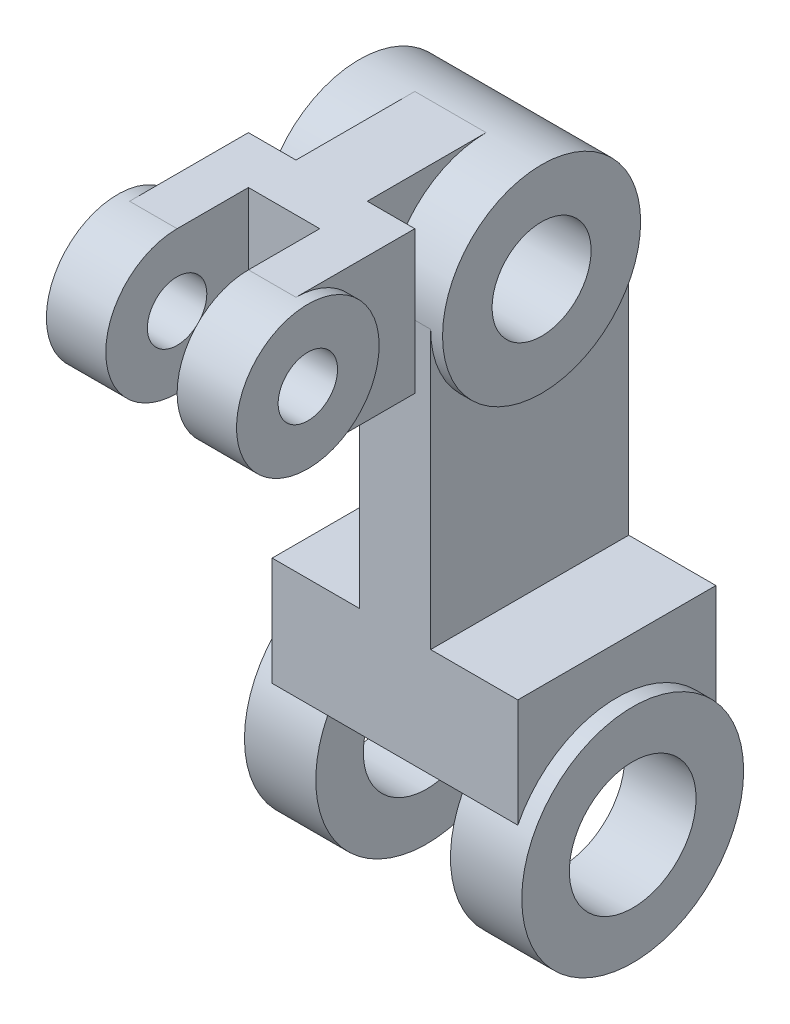
ISO-10303-21;
HEADER;
FILE_DESCRIPTION(('STEP AP214'),'2;1');
FILE_NAME('part.step','',(''),(''),'','','');
FILE_SCHEMA(('AUTOMOTIVE_DESIGN { 1 0 10303 214 1 1 1 1 }'));
ENDSEC;
DATA;
#1=APPLICATION_CONTEXT('core data for automotive mechanical design processes');
#2=APPLICATION_PROTOCOL_DEFINITION('international standard','automotive_design',2000,#1);
#3=PRODUCT_CONTEXT('',#1,'mechanical');
#4=PRODUCT('Part','Part','',(#3));
#5=PRODUCT_RELATED_PRODUCT_CATEGORY('part','',(#4));
#6=PRODUCT_DEFINITION_FORMATION('','',#4);
#7=PRODUCT_DEFINITION_CONTEXT('part definition',#1,'design');
#8=PRODUCT_DEFINITION('design','',#6,#7);
#9=PRODUCT_DEFINITION_SHAPE('','',#8);
#10=(LENGTH_UNIT() NAMED_UNIT(*) SI_UNIT(.MILLI.,.METRE.));
#11=(NAMED_UNIT(*) PLANE_ANGLE_UNIT() SI_UNIT($,.RADIAN.));
#12=(NAMED_UNIT(*) SI_UNIT($,.STERADIAN.) SOLID_ANGLE_UNIT());
#13=UNCERTAINTY_MEASURE_WITH_UNIT(LENGTH_MEASURE(1.E-05),#10,'distance_accuracy_value','');
#14=(GEOMETRIC_REPRESENTATION_CONTEXT(3) GLOBAL_UNCERTAINTY_ASSIGNED_CONTEXT((#13)) GLOBAL_UNIT_ASSIGNED_CONTEXT((#10,
#11,#12)) REPRESENTATION_CONTEXT('',''));
#15=CARTESIAN_POINT('',(0.,0.,0.));
#16=DIRECTION('',(0.,0.,1.));
#17=DIRECTION('',(1.,0.,0.));
#18=AXIS2_PLACEMENT_3D('',#15,#16,#17);
#19=CARTESIAN_POINT('',(13.,94.5660377358491,42.));
#20=DIRECTION('',(1.,0.,0.));
#21=DIRECTION('',(0.,0.,-1.));
#22=AXIS2_PLACEMENT_3D('',#19,#20,#21);
#23=PLANE('',#22);
#24=CARTESIAN_POINT('',(13.,112.566037735849,60.));
#25=DIRECTION('',(1.,0.,0.));
#26=DIRECTION('',(0.,0.,-1.));
#27=AXIS2_PLACEMENT_3D('',#24,#25,#26);
#28=CIRCLE('',#27,7.50000000000001);
#29=CARTESIAN_POINT('',(13.,112.566037735849,52.5));
#30=VERTEX_POINT('',#29);
#31=EDGE_CURVE('E215',#30,#30,#28,.T.);
#32=ORIENTED_EDGE('',*,*,#31,.F.);
#33=EDGE_LOOP('',(#32));
#34=FACE_BOUND('',#33,.T.);
#35=CARTESIAN_POINT('',(13.,112.566037735849,60.));
#36=DIRECTION('',(1.,0.,0.));
#37=DIRECTION('',(0.,0.,-1.));
#38=AXIS2_PLACEMENT_3D('',#35,#36,#37);
#39=CIRCLE('',#38,18.);
#40=CARTESIAN_POINT('',(13.,112.566037735849,42.));
#41=VERTEX_POINT('',#40);
#42=EDGE_CURVE('E235',#41,#41,#39,.F.);
#43=ORIENTED_EDGE('',*,*,#42,.F.);
#44=EDGE_LOOP('',(#43));
#45=FACE_BOUND('',#44,.T.);
#46=ADVANCED_FACE('F41',(#34,#45),#23,.T.);
#47=CARTESIAN_POINT('',(-35.,94.5660377358491,42.));
#48=DIRECTION('',(-1.,0.,0.));
#49=DIRECTION('',(0.,0.,1.));
#50=AXIS2_PLACEMENT_3D('',#47,#48,#49);
#51=PLANE('',#50);
#52=CARTESIAN_POINT('',(-35.,112.566037735849,60.));
#53=DIRECTION('',(-1.,0.,0.));
#54=DIRECTION('',(0.,0.,1.));
#55=AXIS2_PLACEMENT_3D('',#52,#53,#54);
#56=CIRCLE('',#55,7.50000000000001);
#57=CARTESIAN_POINT('',(-35.,112.566037735849,67.5));
#58=VERTEX_POINT('',#57);
#59=EDGE_CURVE('E513',#58,#58,#56,.T.);
#60=ORIENTED_EDGE('',*,*,#59,.F.);
#61=EDGE_LOOP('',(#60));
#62=FACE_BOUND('',#61,.T.);
#63=CARTESIAN_POINT('',(-35.,112.566037735849,60.));
#64=DIRECTION('',(1.,0.,0.));
#65=DIRECTION('',(0.,0.,1.));
#66=AXIS2_PLACEMENT_3D('',#63,#64,#65);
#67=CIRCLE('',#66,18.);
#68=CARTESIAN_POINT('',(-35.,112.566037735849,78.));
#69=VERTEX_POINT('',#68);
#70=EDGE_CURVE('E229',#69,#69,#67,.T.);
#71=ORIENTED_EDGE('',*,*,#70,.F.);
#72=EDGE_LOOP('',(#71));
#73=FACE_BOUND('',#72,.T.);
#74=ADVANCED_FACE('F539',(#62,#73),#51,.T.);
#75=CARTESIAN_POINT('',(0.,94.5660377358491,0.));
#76=DIRECTION('',(0.,-1.,0.));
#77=DIRECTION('',(0.,0.,-1.));
#78=AXIS2_PLACEMENT_3D('',#75,#76,#77);
#79=PLANE('',#78);
#80=DIRECTION('',(0.,0.,-1.));
#81=VECTOR('',#80,1.);
#82=CARTESIAN_POINT('',(9.99999999999999,94.5660377358491,30.));
#83=LINE('',#82,#81);
#84=CARTESIAN_POINT('',(10.,94.5660377358491,60.));
#85=VERTEX_POINT('',#84);
#86=CARTESIAN_POINT('',(9.99999999999999,94.5660377358491,30.));
#87=VERTEX_POINT('',#86);
#88=EDGE_CURVE('E196',#85,#87,#83,.T.);
#89=ORIENTED_EDGE('',*,*,#88,.F.);
#90=DIRECTION('',(-1.,0.,0.));
#91=VECTOR('',#90,1.);
#92=CARTESIAN_POINT('',(35.,94.5660377358491,60.));
#93=LINE('',#92,#91);
#94=CARTESIAN_POINT('',(-2.00000000000002,94.5660377358491,60.));
#95=VERTEX_POINT('',#94);
#96=EDGE_CURVE('E200',#85,#95,#93,.T.);
#97=ORIENTED_EDGE('',*,*,#96,.T.);
#98=DIRECTION('',(0.,0.,1.));
#99=VECTOR('',#98,1.);
#100=CARTESIAN_POINT('',(-2.00000000000002,94.5660377358491,78.));
#101=LINE('',#100,#99);
#102=CARTESIAN_POINT('',(-2.00000000000002,94.5660377358491,42.));
#103=VERTEX_POINT('',#102);
#104=EDGE_CURVE('E207',#103,#95,#101,.T.);
#105=ORIENTED_EDGE('',*,*,#104,.F.);
#106=DIRECTION('',(1.,0.,0.));
#107=VECTOR('',#106,1.);
#108=CARTESIAN_POINT('',(-20.,94.5660377358491,42.));
#109=LINE('',#108,#107);
#110=CARTESIAN_POINT('',(-20.,94.5660377358491,42.));
#111=VERTEX_POINT('',#110);
#112=EDGE_CURVE('E251',#111,#103,#109,.T.);
#113=ORIENTED_EDGE('',*,*,#112,.F.);
#114=DIRECTION('',(0.,0.,-1.));
#115=VECTOR('',#114,1.);
#116=CARTESIAN_POINT('',(-20.,94.5660377358491,78.));
#117=LINE('',#116,#115);
#118=CARTESIAN_POINT('',(-20.,94.5660377358491,60.));
#119=VERTEX_POINT('',#118);
#120=EDGE_CURVE('E248',#119,#111,#117,.T.);
#121=ORIENTED_EDGE('',*,*,#120,.F.);
#122=CARTESIAN_POINT('',(-32.,94.5660377358491,60.));
#123=VERTEX_POINT('',#122);
#124=EDGE_CURVE('E223',#119,#123,#93,.T.);
#125=ORIENTED_EDGE('',*,*,#124,.T.);
#126=DIRECTION('',(0.,0.,1.));
#127=VECTOR('',#126,1.);
#128=CARTESIAN_POINT('',(-32.,94.5660377358491,30.));
#129=LINE('',#128,#127);
#130=CARTESIAN_POINT('',(-32.,94.5660377358491,30.));
#131=VERTEX_POINT('',#130);
#132=EDGE_CURVE('E244',#131,#123,#129,.T.);
#133=ORIENTED_EDGE('',*,*,#132,.F.);
#134=DIRECTION('',(-1.,0.,0.));
#135=VECTOR('',#134,1.);
#136=CARTESIAN_POINT('',(-32.,94.5660377358491,30.));
#137=LINE('',#136,#135);
#138=CARTESIAN_POINT('',(-20.,94.5660377358491,30.));
#139=VERTEX_POINT('',#138);
#140=EDGE_CURVE('E240',#139,#131,#137,.T.);
#141=ORIENTED_EDGE('',*,*,#140,.F.);
#142=DIRECTION('',(0.,0.,1.));
#143=VECTOR('',#142,1.);
#144=CARTESIAN_POINT('',(-20.,94.5660377358491,0.));
#145=LINE('',#144,#143);
#146=CARTESIAN_POINT('',(-20.,94.5660377358491,22.4499443206436));
#147=VERTEX_POINT('',#146);
#148=EDGE_CURVE('E263',#147,#139,#145,.T.);
#149=ORIENTED_EDGE('',*,*,#148,.F.);
#150=DIRECTION('',(1.,0.,0.));
#151=VECTOR('',#150,1.);
#152=CARTESIAN_POINT('',(-34.,94.5660377358491,22.4499443206436));
#153=LINE('',#152,#151);
#154=CARTESIAN_POINT('',(-8.99999999999999,94.5660377358491,22.4499443206436));
#155=VERTEX_POINT('',#154);
#156=EDGE_CURVE('E302',#155,#147,#153,.F.);
#157=ORIENTED_EDGE('',*,*,#156,.F.);
#158=DIRECTION('',(0.,0.,-1.));
#159=VECTOR('',#158,1.);
#160=CARTESIAN_POINT('',(-9.,94.5660377358491,25.));
#161=LINE('',#160,#159);
#162=CARTESIAN_POINT('',(-9.,94.5660377358491,25.));
#163=VERTEX_POINT('',#162);
#164=EDGE_CURVE('E321',#163,#155,#161,.T.);
#165=ORIENTED_EDGE('',*,*,#164,.F.);
#166=DIRECTION('',(-1.,0.,0.));
#167=VECTOR('',#166,1.);
#168=CARTESIAN_POINT('',(0.,94.5660377358491,25.));
#169=LINE('',#168,#167);
#170=CARTESIAN_POINT('',(-2.00000000000001,94.5660377358491,25.));
#171=VERTEX_POINT('',#170);
#172=EDGE_CURVE('E325',#171,#163,#169,.T.);
#173=ORIENTED_EDGE('',*,*,#172,.F.);
#174=DIRECTION('',(0.,0.,-1.));
#175=VECTOR('',#174,1.);
#176=CARTESIAN_POINT('',(-1.99999999999999,94.5660377358491,0.));
#177=LINE('',#176,#175);
#178=CARTESIAN_POINT('',(-2.00000000000001,94.5660377358491,30.));
#179=VERTEX_POINT('',#178);
#180=EDGE_CURVE('E259',#179,#171,#177,.T.);
#181=ORIENTED_EDGE('',*,*,#180,.F.);
#182=DIRECTION('',(-1.,0.,0.));
#183=VECTOR('',#182,1.);
#184=CARTESIAN_POINT('',(9.99999999999999,94.5660377358491,30.));
#185=LINE('',#184,#183);
#186=EDGE_CURVE('E204',#87,#179,#185,.T.);
#187=ORIENTED_EDGE('',*,*,#186,.F.);
#188=EDGE_LOOP('',(#89,#97,#105,#113,#121,#125,#133,#141,#149,#157,#165,#173,#181,#187));
#189=FACE_BOUND('',#188,.T.);
#190=ADVANCED_FACE('F197',(#189),#79,.T.);
#191=CARTESIAN_POINT('',(0.,130.566037735849,0.));
#192=DIRECTION('',(0.,-1.,0.));
#193=DIRECTION('',(0.,0.,-1.));
#194=AXIS2_PLACEMENT_3D('',#191,#192,#193);
#195=PLANE('',#194);
#196=DIRECTION('',(1.,0.,0.));
#197=VECTOR('',#196,1.);
#198=CARTESIAN_POINT('',(0.,130.566037735849,60.));
#199=LINE('',#198,#197);
#200=CARTESIAN_POINT('',(-2.00000000000002,130.566037735849,60.));
#201=VERTEX_POINT('',#200);
#202=CARTESIAN_POINT('',(10.,130.566037735849,60.));
#203=VERTEX_POINT('',#202);
#204=EDGE_CURVE('E51',#201,#203,#199,.T.);
#205=ORIENTED_EDGE('',*,*,#204,.T.);
#206=DIRECTION('',(0.,0.,-1.));
#207=VECTOR('',#206,1.);
#208=CARTESIAN_POINT('',(9.99999999999999,130.566037735849,30.));
#209=LINE('',#208,#207);
#210=CARTESIAN_POINT('',(9.99999999999999,130.566037735849,30.));
#211=VERTEX_POINT('',#210);
#212=EDGE_CURVE('E58',#203,#211,#209,.T.);
#213=ORIENTED_EDGE('',*,*,#212,.T.);
#214=DIRECTION('',(-1.,0.,0.));
#215=VECTOR('',#214,1.);
#216=CARTESIAN_POINT('',(9.99999999999999,130.566037735849,30.));
#217=LINE('',#216,#215);
#218=CARTESIAN_POINT('',(-2.00000000000001,130.566037735849,30.));
#219=VERTEX_POINT('',#218);
#220=EDGE_CURVE('E286',#211,#219,#217,.T.);
#221=ORIENTED_EDGE('',*,*,#220,.T.);
#222=DIRECTION('',(0.,0.,-1.));
#223=VECTOR('',#222,1.);
#224=CARTESIAN_POINT('',(-1.99999999999999,130.566037735849,0.));
#225=LINE('',#224,#223);
#226=CARTESIAN_POINT('',(-2.,130.566037735849,0.));
#227=VERTEX_POINT('',#226);
#228=EDGE_CURVE('E290',#219,#227,#225,.T.);
#229=ORIENTED_EDGE('',*,*,#228,.T.);
#230=DIRECTION('',(-1.,0.,0.));
#231=VECTOR('',#230,1.);
#232=CARTESIAN_POINT('',(-20.,130.566037735849,0.));
#233=LINE('',#232,#231);
#234=CARTESIAN_POINT('',(-20.,130.566037735849,0.));
#235=VERTEX_POINT('',#234);
#236=EDGE_CURVE('E293',#227,#235,#233,.T.);
#237=ORIENTED_EDGE('',*,*,#236,.T.);
#238=DIRECTION('',(0.,0.,1.));
#239=VECTOR('',#238,1.);
#240=CARTESIAN_POINT('',(-20.,130.566037735849,0.));
#241=LINE('',#240,#239);
#242=CARTESIAN_POINT('',(-20.,130.566037735849,30.));
#243=VERTEX_POINT('',#242);
#244=EDGE_CURVE('E245',#235,#243,#241,.T.);
#245=ORIENTED_EDGE('',*,*,#244,.T.);
#246=DIRECTION('',(-1.,0.,0.));
#247=VECTOR('',#246,1.);
#248=CARTESIAN_POINT('',(-32.,130.566037735849,30.));
#249=LINE('',#248,#247);
#250=CARTESIAN_POINT('',(-32.,130.566037735849,30.));
#251=VERTEX_POINT('',#250);
#252=EDGE_CURVE('E239',#243,#251,#249,.T.);
#253=ORIENTED_EDGE('',*,*,#252,.T.);
#254=DIRECTION('',(0.,0.,1.));
#255=VECTOR('',#254,1.);
#256=CARTESIAN_POINT('',(-32.,130.566037735849,30.));
#257=LINE('',#256,#255);
#258=CARTESIAN_POINT('',(-32.,130.566037735849,60.));
#259=VERTEX_POINT('',#258);
#260=EDGE_CURVE('E270',#251,#259,#257,.T.);
#261=ORIENTED_EDGE('',*,*,#260,.T.);
#262=CARTESIAN_POINT('',(-20.,130.566037735849,60.));
#263=VERTEX_POINT('',#262);
#264=EDGE_CURVE('E11',#259,#263,#199,.T.);
#265=ORIENTED_EDGE('',*,*,#264,.T.);
#266=DIRECTION('',(0.,0.,-1.));
#267=VECTOR('',#266,1.);
#268=CARTESIAN_POINT('',(-20.,130.566037735849,78.));
#269=LINE('',#268,#267);
#270=CARTESIAN_POINT('',(-20.,130.566037735849,42.));
#271=VERTEX_POINT('',#270);
#272=EDGE_CURVE('E273',#263,#271,#269,.T.);
#273=ORIENTED_EDGE('',*,*,#272,.T.);
#274=DIRECTION('',(1.,0.,0.));
#275=VECTOR('',#274,1.);
#276=CARTESIAN_POINT('',(-20.,130.566037735849,42.));
#277=LINE('',#276,#275);
#278=CARTESIAN_POINT('',(-2.00000000000002,130.566037735849,42.));
#279=VERTEX_POINT('',#278);
#280=EDGE_CURVE('E276',#271,#279,#277,.T.);
#281=ORIENTED_EDGE('',*,*,#280,.T.);
#282=DIRECTION('',(0.,0.,1.));
#283=VECTOR('',#282,1.);
#284=CARTESIAN_POINT('',(-2.00000000000002,130.566037735849,78.));
#285=LINE('',#284,#283);
#286=EDGE_CURVE('E280',#279,#201,#285,.T.);
#287=ORIENTED_EDGE('',*,*,#286,.T.);
#288=EDGE_LOOP('',(#205,#213,#221,#229,#237,#245,#253,#261,#265,#273,#281,#287));
#289=FACE_BOUND('',#288,.T.);
#290=ADVANCED_FACE('F479',(#289),#195,.F.);
#291=CARTESIAN_POINT('',(-2.00000000000002,94.5660377358491,78.));
#292=DIRECTION('',(-1.,0.,0.));
#293=DIRECTION('',(0.,0.,1.));
#294=AXIS2_PLACEMENT_3D('',#291,#292,#293);
#295=PLANE('',#294);
#296=CARTESIAN_POINT('',(-2.00000000000002,112.566037735849,60.));
#297=DIRECTION('',(-1.,0.,0.));
#298=DIRECTION('',(0.,0.,1.));
#299=AXIS2_PLACEMENT_3D('',#296,#297,#298);
#300=CIRCLE('',#299,7.50000000000001);
#301=CARTESIAN_POINT('',(-2.00000000000002,112.566037735849,67.5));
#302=VERTEX_POINT('',#301);
#303=EDGE_CURVE('E509',#302,#302,#300,.T.);
#304=ORIENTED_EDGE('',*,*,#303,.F.);
#305=EDGE_LOOP('',(#304));
#306=FACE_BOUND('',#305,.T.);
#307=ORIENTED_EDGE('',*,*,#104,.T.);
#308=CARTESIAN_POINT('',(-2.00000000000002,112.566037735849,60.));
#309=DIRECTION('',(-1.,0.,0.));
#310=DIRECTION('',(0.,0.,1.));
#311=AXIS2_PLACEMENT_3D('',#308,#309,#310);
#312=CIRCLE('',#311,18.);
#313=EDGE_CURVE('E219',#201,#95,#312,.F.);
#314=ORIENTED_EDGE('',*,*,#313,.F.);
#315=ORIENTED_EDGE('',*,*,#286,.F.);
#316=DIRECTION('',(0.,1.,0.));
#317=VECTOR('',#316,1.);
#318=CARTESIAN_POINT('',(-2.00000000000002,94.5660377358491,42.));
#319=LINE('',#318,#317);
#320=EDGE_CURVE('E309',#103,#279,#319,.T.);
#321=ORIENTED_EDGE('',*,*,#320,.F.);
#322=EDGE_LOOP('',(#307,#314,#315,#321));
#323=FACE_BOUND('',#322,.T.);
#324=ADVANCED_FACE('F482',(#306,#323),#295,.T.);
#325=CARTESIAN_POINT('',(-20.,94.5660377358491,78.));
#326=DIRECTION('',(1.,0.,0.));
#327=DIRECTION('',(0.,0.,-1.));
#328=AXIS2_PLACEMENT_3D('',#325,#326,#327);
#329=PLANE('',#328);
#330=CARTESIAN_POINT('',(-20.,112.566037735849,60.));
#331=DIRECTION('',(1.,0.,0.));
#332=DIRECTION('',(0.,0.,-1.));
#333=AXIS2_PLACEMENT_3D('',#330,#331,#332);
#334=CIRCLE('',#333,7.50000000000001);
#335=CARTESIAN_POINT('',(-20.,112.566037735849,52.5));
#336=VERTEX_POINT('',#335);
#337=EDGE_CURVE('E45',#336,#336,#334,.T.);
#338=ORIENTED_EDGE('',*,*,#337,.F.);
#339=EDGE_LOOP('',(#338));
#340=FACE_BOUND('',#339,.T.);
#341=CARTESIAN_POINT('',(-20.,112.566037735849,60.));
#342=DIRECTION('',(1.,0.,0.));
#343=DIRECTION('',(0.,0.,-1.));
#344=AXIS2_PLACEMENT_3D('',#341,#342,#343);
#345=CIRCLE('',#344,18.);
#346=EDGE_CURVE('E222',#119,#263,#345,.F.);
#347=ORIENTED_EDGE('',*,*,#346,.F.);
#348=ORIENTED_EDGE('',*,*,#120,.T.);
#349=DIRECTION('',(0.,1.,0.));
#350=VECTOR('',#349,1.);
#351=CARTESIAN_POINT('',(-20.,94.5660377358491,42.));
#352=LINE('',#351,#350);
#353=EDGE_CURVE('E312',#111,#271,#352,.T.);
#354=ORIENTED_EDGE('',*,*,#353,.T.);
#355=ORIENTED_EDGE('',*,*,#272,.F.);
#356=EDGE_LOOP('',(#347,#348,#354,#355));
#357=FACE_BOUND('',#356,.T.);
#358=ADVANCED_FACE('F492',(#340,#357),#329,.T.);
#359=CARTESIAN_POINT('',(-34.,-4.43396226415092,0.));
#360=DIRECTION('',(1.,0.,0.));
#361=DIRECTION('',(0.,0.,-1.));
#362=AXIS2_PLACEMENT_3D('',#359,#360,#361);
#363=CYLINDRICAL_SURFACE('',#362,28.);
#364=DIRECTION('',(1.,0.,0.));
#365=VECTOR('',#364,1.);
#366=CARTESIAN_POINT('',(-34.,8.17555794876757,25.));
#367=LINE('',#366,#365);
#368=CARTESIAN_POINT('',(-17.,8.17555794876757,25.));
#369=VERTEX_POINT('',#368);
#370=CARTESIAN_POINT('',(17.,8.17555794876757,25.));
#371=VERTEX_POINT('',#370);
#372=EDGE_CURVE('E411',#369,#371,#367,.T.);
#373=ORIENTED_EDGE('',*,*,#372,.F.);
#374=CARTESIAN_POINT('',(-17.,-4.43396226415092,0.));
#375=DIRECTION('',(1.,0.,0.));
#376=DIRECTION('',(0.,0.,-1.));
#377=AXIS2_PLACEMENT_3D('',#374,#375,#376);
#378=CIRCLE('',#377,28.);
#379=CARTESIAN_POINT('',(-17.,8.17555794876757,-25.));
#380=VERTEX_POINT('',#379);
#381=EDGE_CURVE('E346',#380,#369,#378,.T.);
#382=ORIENTED_EDGE('',*,*,#381,.F.);
#383=DIRECTION('',(1.,0.,0.));
#384=VECTOR('',#383,1.);
#385=CARTESIAN_POINT('',(-34.,8.17555794876757,-25.));
#386=LINE('',#385,#384);
#387=CARTESIAN_POINT('',(17.,8.17555794876757,-25.));
#388=VERTEX_POINT('',#387);
#389=EDGE_CURVE('E475',#380,#388,#386,.T.);
#390=ORIENTED_EDGE('',*,*,#389,.T.);
#391=CARTESIAN_POINT('',(17.,-4.43396226415092,0.));
#392=DIRECTION('',(1.,0.,0.));
#393=DIRECTION('',(0.,0.,-1.));
#394=AXIS2_PLACEMENT_3D('',#391,#392,#393);
#395=CIRCLE('',#394,28.);
#396=EDGE_CURVE('E371',#388,#371,#395,.T.);
#397=ORIENTED_EDGE('',*,*,#396,.T.);
#398=EDGE_LOOP('',(#373,#382,#390,#397));
#399=FACE_BOUND('',#398,.T.);
#400=ADVANCED_FACE('F525',(#399),#363,.F.);
#401=CARTESIAN_POINT('',(-34.,130.566037735849,25.));
#402=DIRECTION('',(1.,0.,0.));
#403=DIRECTION('',(0.,1.,0.));
#404=AXIS2_PLACEMENT_3D('',#401,#402,#403);
#405=PLANE('',#404);
#406=CARTESIAN_POINT('',(-34.,105.566037735849,0.));
#407=DIRECTION('',(-1.,0.,0.));
#408=DIRECTION('',(0.,-1.,0.));
#409=AXIS2_PLACEMENT_3D('',#406,#407,#408);
#410=CIRCLE('',#409,12.5);
#411=CARTESIAN_POINT('',(-34.,93.0660377358491,0.));
#412=VERTEX_POINT('',#411);
#413=EDGE_CURVE('E375',#412,#412,#410,.T.);
#414=ORIENTED_EDGE('',*,*,#413,.F.);
#415=EDGE_LOOP('',(#414));
#416=FACE_BOUND('',#415,.T.);
#417=CARTESIAN_POINT('',(-34.,105.566037735849,0.));
#418=DIRECTION('',(-1.,0.,0.));
#419=DIRECTION('',(0.,0.,-1.));
#420=AXIS2_PLACEMENT_3D('',#417,#418,#419);
#421=CIRCLE('',#420,25.);
#422=CARTESIAN_POINT('',(-34.,105.566037735849,-25.));
#423=VERTEX_POINT('',#422);
#424=EDGE_CURVE('E388',#423,#423,#421,.T.);
#425=ORIENTED_EDGE('',*,*,#424,.T.);
#426=EDGE_LOOP('',(#425));
#427=FACE_BOUND('',#426,.T.);
#428=ADVANCED_FACE('F531',(#416,#427),#405,.F.);
#429=CARTESIAN_POINT('',(12.,80.5660377358491,25.));
#430=DIRECTION('',(-1.,0.,0.));
#431=DIRECTION('',(0.,0.,1.));
#432=AXIS2_PLACEMENT_3D('',#429,#430,#431);
#433=PLANE('',#432);
#434=CARTESIAN_POINT('',(12.,105.566037735849,0.));
#435=DIRECTION('',(-1.,0.,0.));
#436=DIRECTION('',(0.,0.,1.));
#437=AXIS2_PLACEMENT_3D('',#434,#435,#436);
#438=CIRCLE('',#437,12.5);
#439=CARTESIAN_POINT('',(12.,105.566037735849,12.5));
#440=VERTEX_POINT('',#439);
#441=EDGE_CURVE('E379',#440,#440,#438,.T.);
#442=ORIENTED_EDGE('',*,*,#441,.T.);
#443=EDGE_LOOP('',(#442));
#444=FACE_BOUND('',#443,.T.);
#445=CARTESIAN_POINT('',(12.,105.566037735849,0.));
#446=DIRECTION('',(-1.,0.,0.));
#447=DIRECTION('',(0.,0.,1.));
#448=AXIS2_PLACEMENT_3D('',#445,#446,#447);
#449=CIRCLE('',#448,25.);
#450=CARTESIAN_POINT('',(12.,105.566037735849,25.));
#451=VERTEX_POINT('',#450);
#452=EDGE_CURVE('E410',#451,#451,#449,.F.);
#453=ORIENTED_EDGE('',*,*,#452,.T.);
#454=EDGE_LOOP('',(#453));
#455=FACE_BOUND('',#454,.T.);
#456=ADVANCED_FACE('F695',(#444,#455),#433,.F.);
#457=CARTESIAN_POINT('',(0.,0.,25.));
#458=DIRECTION('',(0.,0.,-1.));
#459=DIRECTION('',(-1.,0.,0.));
#460=AXIS2_PLACEMENT_3D('',#457,#458,#459);
#461=PLANE('',#460);
#462=DIRECTION('',(1.,0.,0.));
#463=VECTOR('',#462,1.);
#464=CARTESIAN_POINT('',(-34.,105.566037735849,25.));
#465=LINE('',#464,#463);
#466=CARTESIAN_POINT('',(-2.00000000000001,105.566037735849,25.));
#467=VERTEX_POINT('',#466);
#468=CARTESIAN_POINT('',(9.,105.566037735849,25.));
#469=VERTEX_POINT('',#468);
#470=EDGE_CURVE('E393',#467,#469,#465,.T.);
#471=ORIENTED_EDGE('',*,*,#470,.F.);
#472=DIRECTION('',(0.,-1.,0.));
#473=VECTOR('',#472,1.);
#474=CARTESIAN_POINT('',(-2.00000000000001,0.,25.));
#475=LINE('',#474,#473);
#476=EDGE_CURVE('E333',#467,#171,#475,.T.);
#477=ORIENTED_EDGE('',*,*,#476,.T.);
#478=ORIENTED_EDGE('',*,*,#172,.T.);
#479=DIRECTION('',(0.,-1.,0.));
#480=VECTOR('',#479,1.);
#481=CARTESIAN_POINT('',(-9.,35.5660377358491,25.));
#482=LINE('',#481,#480);
#483=CARTESIAN_POINT('',(-9.,35.5660377358491,25.));
#484=VERTEX_POINT('',#483);
#485=EDGE_CURVE('E427',#163,#484,#482,.T.);
#486=ORIENTED_EDGE('',*,*,#485,.T.);
#487=DIRECTION('',(-1.,0.,0.));
#488=VECTOR('',#487,1.);
#489=CARTESIAN_POINT('',(-31.,35.5660377358491,25.));
#490=LINE('',#489,#488);
#491=CARTESIAN_POINT('',(-31.,35.5660377358491,25.));
#492=VERTEX_POINT('',#491);
#493=EDGE_CURVE('E430',#484,#492,#490,.T.);
#494=ORIENTED_EDGE('',*,*,#493,.T.);
#495=DIRECTION('',(0.,-1.,0.));
#496=VECTOR('',#495,1.);
#497=CARTESIAN_POINT('',(-31.,-32.4339622641509,25.));
#498=LINE('',#497,#496);
#499=CARTESIAN_POINT('',(-31.,8.17555794876757,25.));
#500=VERTEX_POINT('',#499);
#501=EDGE_CURVE('E433',#492,#500,#498,.T.);
#502=ORIENTED_EDGE('',*,*,#501,.T.);
#503=EDGE_CURVE('E406',#500,#369,#367,.T.);
#504=ORIENTED_EDGE('',*,*,#503,.T.);
#505=ORIENTED_EDGE('',*,*,#372,.T.);
#506=CARTESIAN_POINT('',(31.,8.17555794876757,25.));
#507=VERTEX_POINT('',#506);
#508=EDGE_CURVE('E405',#371,#507,#367,.T.);
#509=ORIENTED_EDGE('',*,*,#508,.T.);
#510=DIRECTION('',(0.,1.,0.));
#511=VECTOR('',#510,1.);
#512=CARTESIAN_POINT('',(31.,-32.4339622641509,25.));
#513=LINE('',#512,#511);
#514=CARTESIAN_POINT('',(31.,35.5660377358491,25.));
#515=VERTEX_POINT('',#514);
#516=EDGE_CURVE('E416',#507,#515,#513,.T.);
#517=ORIENTED_EDGE('',*,*,#516,.T.);
#518=DIRECTION('',(-1.,0.,0.));
#519=VECTOR('',#518,1.);
#520=CARTESIAN_POINT('',(31.,35.5660377358491,25.));
#521=LINE('',#520,#519);
#522=CARTESIAN_POINT('',(9.,35.5660377358491,25.));
#523=VERTEX_POINT('',#522);
#524=EDGE_CURVE('E419',#515,#523,#521,.T.);
#525=ORIENTED_EDGE('',*,*,#524,.T.);
#526=DIRECTION('',(0.,1.,0.));
#527=VECTOR('',#526,1.);
#528=CARTESIAN_POINT('',(9.,35.5660377358491,25.));
#529=LINE('',#528,#527);
#530=EDGE_CURVE('E423',#523,#469,#529,.T.);
#531=ORIENTED_EDGE('',*,*,#530,.T.);
#532=EDGE_LOOP('',(#471,#477,#478,#486,#494,#502,#504,#505,#509,#517,#525,#531));
#533=FACE_BOUND('',#532,.T.);
#534=ADVANCED_FACE('F689',(#533),#461,.F.);
#535=CARTESIAN_POINT('',(0.,0.,-25.));
#536=DIRECTION('',(0.,0.,-1.));
#537=DIRECTION('',(-1.,0.,0.));
#538=AXIS2_PLACEMENT_3D('',#535,#536,#537);
#539=PLANE('',#538);
#540=DIRECTION('',(0.,-1.,0.));
#541=VECTOR('',#540,1.);
#542=CARTESIAN_POINT('',(-9.,35.5660377358491,-25.));
#543=LINE('',#542,#541);
#544=CARTESIAN_POINT('',(-9.,105.566037735849,-25.));
#545=VERTEX_POINT('',#544);
#546=CARTESIAN_POINT('',(-9.,35.5660377358491,-25.));
#547=VERTEX_POINT('',#546);
#548=EDGE_CURVE('E447',#545,#547,#543,.T.);
#549=ORIENTED_EDGE('',*,*,#548,.F.);
#550=DIRECTION('',(1.,0.,0.));
#551=VECTOR('',#550,1.);
#552=CARTESIAN_POINT('',(-34.,105.566037735849,-25.));
#553=LINE('',#552,#551);
#554=CARTESIAN_POINT('',(9.,105.566037735849,-25.));
#555=VERTEX_POINT('',#554);
#556=EDGE_CURVE('E392',#545,#555,#553,.T.);
#557=ORIENTED_EDGE('',*,*,#556,.T.);
#558=DIRECTION('',(0.,1.,0.));
#559=VECTOR('',#558,1.);
#560=CARTESIAN_POINT('',(9.,35.5660377358491,-25.));
#561=LINE('',#560,#559);
#562=CARTESIAN_POINT('',(9.,35.5660377358491,-25.));
#563=VERTEX_POINT('',#562);
#564=EDGE_CURVE('E443',#563,#555,#561,.T.);
#565=ORIENTED_EDGE('',*,*,#564,.F.);
#566=DIRECTION('',(-1.,0.,0.));
#567=VECTOR('',#566,1.);
#568=CARTESIAN_POINT('',(31.,35.5660377358491,-25.));
#569=LINE('',#568,#567);
#570=CARTESIAN_POINT('',(31.,35.5660377358491,-25.));
#571=VERTEX_POINT('',#570);
#572=EDGE_CURVE('E440',#571,#563,#569,.T.);
#573=ORIENTED_EDGE('',*,*,#572,.F.);
#574=DIRECTION('',(0.,1.,0.));
#575=VECTOR('',#574,1.);
#576=CARTESIAN_POINT('',(31.,-32.4339622641509,-25.));
#577=LINE('',#576,#575);
#578=CARTESIAN_POINT('',(31.,8.17555794876757,-25.));
#579=VERTEX_POINT('',#578);
#580=EDGE_CURVE('E415',#579,#571,#577,.T.);
#581=ORIENTED_EDGE('',*,*,#580,.F.);
#582=EDGE_CURVE('E471',#388,#579,#386,.T.);
#583=ORIENTED_EDGE('',*,*,#582,.F.);
#584=ORIENTED_EDGE('',*,*,#389,.F.);
#585=CARTESIAN_POINT('',(-31.,8.17555794876757,-25.));
#586=VERTEX_POINT('',#585);
#587=EDGE_CURVE('E472',#586,#380,#386,.T.);
#588=ORIENTED_EDGE('',*,*,#587,.F.);
#589=DIRECTION('',(0.,-1.,0.));
#590=VECTOR('',#589,1.);
#591=CARTESIAN_POINT('',(-31.,-32.4339622641509,-25.));
#592=LINE('',#591,#590);
#593=CARTESIAN_POINT('',(-31.,35.5660377358491,-25.));
#594=VERTEX_POINT('',#593);
#595=EDGE_CURVE('E420',#594,#586,#592,.T.);
#596=ORIENTED_EDGE('',*,*,#595,.F.);
#597=DIRECTION('',(-1.,0.,0.));
#598=VECTOR('',#597,1.);
#599=CARTESIAN_POINT('',(-31.,35.5660377358491,-25.));
#600=LINE('',#599,#598);
#601=EDGE_CURVE('E450',#547,#594,#600,.T.);
#602=ORIENTED_EDGE('',*,*,#601,.F.);
#603=EDGE_LOOP('',(#549,#557,#565,#573,#581,#583,#584,#588,#596,#602));
#604=FACE_BOUND('',#603,.T.);
#605=ADVANCED_FACE('F694',(#604),#539,.T.);
#606=CARTESIAN_POINT('',(31.,-32.4339622641509,25.));
#607=DIRECTION('',(-1.,0.,0.));
#608=DIRECTION('',(0.,-1.,0.));
#609=AXIS2_PLACEMENT_3D('',#606,#607,#608);
#610=PLANE('',#609);
#611=ORIENTED_EDGE('',*,*,#516,.F.);
#612=CARTESIAN_POINT('',(31.,-4.43396226415092,0.));
#613=DIRECTION('',(1.,0.,0.));
#614=DIRECTION('',(0.,0.,-1.));
#615=AXIS2_PLACEMENT_3D('',#612,#613,#614);
#616=CIRCLE('',#615,28.);
#617=EDGE_CURVE('E387',#579,#507,#616,.T.);
#618=ORIENTED_EDGE('',*,*,#617,.F.);
#619=ORIENTED_EDGE('',*,*,#580,.T.);
#620=DIRECTION('',(0.,0.,-1.));
#621=VECTOR('',#620,1.);
#622=CARTESIAN_POINT('',(31.,35.5660377358491,25.));
#623=LINE('',#622,#621);
#624=EDGE_CURVE('E467',#515,#571,#623,.T.);
#625=ORIENTED_EDGE('',*,*,#624,.F.);
#626=EDGE_LOOP('',(#611,#618,#619,#625));
#627=FACE_BOUND('',#626,.T.);
#628=ADVANCED_FACE('F43',(#627),#610,.F.);
#629=CARTESIAN_POINT('',(31.,35.5660377358491,25.));
#630=DIRECTION('',(0.,-1.,0.));
#631=DIRECTION('',(1.,0.,0.));
#632=AXIS2_PLACEMENT_3D('',#629,#630,#631);
#633=PLANE('',#632);
#634=ORIENTED_EDGE('',*,*,#572,.T.);
#635=DIRECTION('',(0.,0.,-1.));
#636=VECTOR('',#635,1.);
#637=CARTESIAN_POINT('',(9.,35.5660377358491,25.));
#638=LINE('',#637,#636);
#639=EDGE_CURVE('E463',#523,#563,#638,.T.);
#640=ORIENTED_EDGE('',*,*,#639,.F.);
#641=ORIENTED_EDGE('',*,*,#524,.F.);
#642=ORIENTED_EDGE('',*,*,#624,.T.);
#643=EDGE_LOOP('',(#634,#640,#641,#642));
#644=FACE_BOUND('',#643,.T.);
#645=ADVANCED_FACE('F816',(#644),#633,.F.);
#646=CARTESIAN_POINT('',(9.,35.5660377358491,25.));
#647=DIRECTION('',(-1.,0.,0.));
#648=DIRECTION('',(0.,-1.,0.));
#649=AXIS2_PLACEMENT_3D('',#646,#647,#648);
#650=PLANE('',#649);
#651=ORIENTED_EDGE('',*,*,#564,.T.);
#652=CARTESIAN_POINT('',(9.,105.566037735849,0.));
#653=DIRECTION('',(1.,0.,0.));
#654=DIRECTION('',(0.,0.,-1.));
#655=AXIS2_PLACEMENT_3D('',#652,#653,#654);
#656=CIRCLE('',#655,25.);
#657=EDGE_CURVE('E383',#469,#555,#656,.T.);
#658=ORIENTED_EDGE('',*,*,#657,.F.);
#659=ORIENTED_EDGE('',*,*,#530,.F.);
#660=ORIENTED_EDGE('',*,*,#639,.T.);
#661=EDGE_LOOP('',(#651,#658,#659,#660));
#662=FACE_BOUND('',#661,.T.);
#663=ADVANCED_FACE('F679',(#662),#650,.F.);
#664=CARTESIAN_POINT('',(-9.,35.5660377358491,25.));
#665=DIRECTION('',(1.,0.,0.));
#666=DIRECTION('',(0.,1.,0.));
#667=AXIS2_PLACEMENT_3D('',#664,#665,#666);
#668=PLANE('',#667);
#669=ORIENTED_EDGE('',*,*,#485,.F.);
#670=ORIENTED_EDGE('',*,*,#164,.T.);
#671=CARTESIAN_POINT('',(-9.,105.566037735849,0.));
#672=DIRECTION('',(1.,0.,0.));
#673=DIRECTION('',(0.,1.,0.));
#674=AXIS2_PLACEMENT_3D('',#671,#672,#673);
#675=CIRCLE('',#674,25.);
#676=EDGE_CURVE('E380',#155,#545,#675,.T.);
#677=ORIENTED_EDGE('',*,*,#676,.T.);
#678=ORIENTED_EDGE('',*,*,#548,.T.);
#679=DIRECTION('',(0.,0.,-1.));
#680=VECTOR('',#679,1.);
#681=CARTESIAN_POINT('',(-9.,35.5660377358491,25.));
#682=LINE('',#681,#680);
#683=EDGE_CURVE('E459',#484,#547,#682,.T.);
#684=ORIENTED_EDGE('',*,*,#683,.F.);
#685=EDGE_LOOP('',(#669,#670,#677,#678,#684));
#686=FACE_BOUND('',#685,.T.);
#687=ADVANCED_FACE('F673',(#686),#668,.F.);
#688=CARTESIAN_POINT('',(-31.,35.5660377358491,25.));
#689=DIRECTION('',(0.,-1.,0.));
#690=DIRECTION('',(1.,0.,0.));
#691=AXIS2_PLACEMENT_3D('',#688,#689,#690);
#692=PLANE('',#691);
#693=ORIENTED_EDGE('',*,*,#601,.T.);
#694=DIRECTION('',(0.,0.,-1.));
#695=VECTOR('',#694,1.);
#696=CARTESIAN_POINT('',(-31.,35.5660377358491,25.));
#697=LINE('',#696,#695);
#698=EDGE_CURVE('E437',#492,#594,#697,.T.);
#699=ORIENTED_EDGE('',*,*,#698,.F.);
#700=ORIENTED_EDGE('',*,*,#493,.F.);
#701=ORIENTED_EDGE('',*,*,#683,.T.);
#702=EDGE_LOOP('',(#693,#699,#700,#701));
#703=FACE_BOUND('',#702,.T.);
#704=ADVANCED_FACE('F678',(#703),#692,.F.);
#705=CARTESIAN_POINT('',(-31.,-32.4339622641509,25.));
#706=DIRECTION('',(1.,0.,0.));
#707=DIRECTION('',(0.,1.,0.));
#708=AXIS2_PLACEMENT_3D('',#705,#706,#707);
#709=PLANE('',#708);
#710=ORIENTED_EDGE('',*,*,#595,.T.);
#711=CARTESIAN_POINT('',(-31.,-4.43396226415092,0.));
#712=DIRECTION('',(1.,0.,0.));
#713=DIRECTION('',(0.,1.,0.));
#714=AXIS2_PLACEMENT_3D('',#711,#712,#713);
#715=CIRCLE('',#714,28.);
#716=EDGE_CURVE('E396',#586,#500,#715,.T.);
#717=ORIENTED_EDGE('',*,*,#716,.T.);
#718=ORIENTED_EDGE('',*,*,#501,.F.);
#719=ORIENTED_EDGE('',*,*,#698,.T.);
#720=EDGE_LOOP('',(#710,#717,#718,#719));
#721=FACE_BOUND('',#720,.T.);
#722=ADVANCED_FACE('F665',(#721),#709,.F.);
#723=CARTESIAN_POINT('',(-34.,105.566037735849,0.));
#724=DIRECTION('',(1.,0.,0.));
#725=DIRECTION('',(0.,0.,-1.));
#726=AXIS2_PLACEMENT_3D('',#723,#724,#725);
#727=CYLINDRICAL_SURFACE('',#726,25.);
#728=ORIENTED_EDGE('',*,*,#156,.T.);
#729=CARTESIAN_POINT('',(-20.,105.566037735849,0.));
#730=DIRECTION('',(-1.,0.,0.));
#731=DIRECTION('',(0.,0.,1.));
#732=AXIS2_PLACEMENT_3D('',#729,#730,#731);
#733=CIRCLE('',#732,25.);
#734=EDGE_CURVE('E337',#147,#235,#733,.T.);
#735=ORIENTED_EDGE('',*,*,#734,.T.);
#736=ORIENTED_EDGE('',*,*,#236,.F.);
#737=CARTESIAN_POINT('',(-1.99999999999999,105.566037735849,0.));
#738=DIRECTION('',(1.,0.,0.));
#739=DIRECTION('',(0.,0.,-1.));
#740=AXIS2_PLACEMENT_3D('',#737,#738,#739);
#741=CIRCLE('',#740,25.);
#742=EDGE_CURVE('E329',#227,#467,#741,.T.);
#743=ORIENTED_EDGE('',*,*,#742,.T.);
#744=ORIENTED_EDGE('',*,*,#470,.T.);
#745=ORIENTED_EDGE('',*,*,#657,.T.);
#746=ORIENTED_EDGE('',*,*,#556,.F.);
#747=ORIENTED_EDGE('',*,*,#676,.F.);
#748=EDGE_LOOP('',(#728,#735,#736,#743,#744,#745,#746,#747));
#749=FACE_BOUND('',#748,.T.);
#750=ORIENTED_EDGE('',*,*,#452,.F.);
#751=EDGE_LOOP('',(#750));
#752=FACE_BOUND('',#751,.T.);
#753=ORIENTED_EDGE('',*,*,#424,.F.);
#754=EDGE_LOOP('',(#753));
#755=FACE_BOUND('',#754,.T.);
#756=ADVANCED_FACE('F619',(#749,#752,#755),#727,.T.);
#757=CARTESIAN_POINT('',(31.,105.566037735849,0.));
#758=DIRECTION('',(-1.,0.,0.));
#759=DIRECTION('',(0.,-1.,0.));
#760=AXIS2_PLACEMENT_3D('',#757,#758,#759);
#761=CYLINDRICAL_SURFACE('',#760,12.5);
#762=ORIENTED_EDGE('',*,*,#413,.T.);
#763=EDGE_LOOP('',(#762));
#764=FACE_BOUND('',#763,.T.);
#765=ORIENTED_EDGE('',*,*,#441,.F.);
#766=EDGE_LOOP('',(#765));
#767=FACE_BOUND('',#766,.T.);
#768=ADVANCED_FACE('F612',(#764,#767),#761,.F.);
#769=CARTESIAN_POINT('',(17.,-4.43396226415092,0.));
#770=DIRECTION('',(1.,0.,0.));
#771=DIRECTION('',(0.,0.,-1.));
#772=AXIS2_PLACEMENT_3D('',#769,#770,#771);
#773=CYLINDRICAL_SURFACE('',#772,28.);
#774=CARTESIAN_POINT('',(35.,-4.43396226415092,0.));
#775=DIRECTION('',(1.,0.,0.));
#776=DIRECTION('',(0.,0.,-1.));
#777=AXIS2_PLACEMENT_3D('',#774,#775,#776);
#778=CIRCLE('',#777,28.);
#779=CARTESIAN_POINT('',(35.,-4.43396226415092,-28.));
#780=VERTEX_POINT('',#779);
#781=EDGE_CURVE('E362',#780,#780,#778,.T.);
#782=ORIENTED_EDGE('',*,*,#781,.F.);
#783=EDGE_LOOP('',(#782));
#784=FACE_BOUND('',#783,.T.);
#785=ORIENTED_EDGE('',*,*,#508,.F.);
#786=EDGE_CURVE('E370',#371,#388,#395,.T.);
#787=ORIENTED_EDGE('',*,*,#786,.T.);
#788=ORIENTED_EDGE('',*,*,#582,.T.);
#789=ORIENTED_EDGE('',*,*,#617,.T.);
#790=EDGE_LOOP('',(#785,#787,#788,#789));
#791=FACE_BOUND('',#790,.T.);
#792=ADVANCED_FACE('F618',(#784,#791),#773,.T.);
#793=CARTESIAN_POINT('',(17.,-4.43396226415092,0.));
#794=DIRECTION('',(1.,0.,0.));
#795=DIRECTION('',(0.,0.,-1.));
#796=AXIS2_PLACEMENT_3D('',#793,#794,#795);
#797=PLANE('',#796);
#798=CARTESIAN_POINT('',(17.,-4.43396226415092,0.));
#799=DIRECTION('',(1.,0.,0.));
#800=DIRECTION('',(0.,0.,-1.));
#801=AXIS2_PLACEMENT_3D('',#798,#799,#800);
#802=CIRCLE('',#801,16.);
#803=CARTESIAN_POINT('',(17.,-4.43396226415092,-16.));
#804=VERTEX_POINT('',#803);
#805=EDGE_CURVE('E366',#804,#804,#802,.T.);
#806=ORIENTED_EDGE('',*,*,#805,.T.);
#807=EDGE_LOOP('',(#806));
#808=FACE_BOUND('',#807,.T.);
#809=ORIENTED_EDGE('',*,*,#396,.F.);
#810=ORIENTED_EDGE('',*,*,#786,.F.);
#811=EDGE_LOOP('',(#809,#810));
#812=FACE_BOUND('',#811,.T.);
#813=ADVANCED_FACE('F788',(#808,#812),#797,.F.);
#814=CARTESIAN_POINT('',(17.,-4.43396226415092,0.));
#815=DIRECTION('',(1.,0.,0.));
#816=DIRECTION('',(0.,0.,-1.));
#817=AXIS2_PLACEMENT_3D('',#814,#815,#816);
#818=CYLINDRICAL_SURFACE('',#817,16.);
#819=ORIENTED_EDGE('',*,*,#805,.F.);
#820=EDGE_LOOP('',(#819));
#821=FACE_BOUND('',#820,.T.);
#822=CARTESIAN_POINT('',(35.,-4.43396226415092,0.));
#823=DIRECTION('',(1.,0.,0.));
#824=DIRECTION('',(0.,0.,-1.));
#825=AXIS2_PLACEMENT_3D('',#822,#823,#824);
#826=CIRCLE('',#825,16.);
#827=CARTESIAN_POINT('',(35.,-4.43396226415092,-16.));
#828=VERTEX_POINT('',#827);
#829=EDGE_CURVE('E358',#828,#828,#826,.T.);
#830=ORIENTED_EDGE('',*,*,#829,.T.);
#831=EDGE_LOOP('',(#830));
#832=FACE_BOUND('',#831,.T.);
#833=ADVANCED_FACE('F778',(#821,#832),#818,.F.);
#834=CARTESIAN_POINT('',(35.,-4.43396226415092,0.));
#835=DIRECTION('',(1.,0.,0.));
#836=DIRECTION('',(0.,0.,-1.));
#837=AXIS2_PLACEMENT_3D('',#834,#835,#836);
#838=PLANE('',#837);
#839=ORIENTED_EDGE('',*,*,#781,.T.);
#840=EDGE_LOOP('',(#839));
#841=FACE_BOUND('',#840,.T.);
#842=ORIENTED_EDGE('',*,*,#829,.F.);
#843=EDGE_LOOP('',(#842));
#844=FACE_BOUND('',#843,.T.);
#845=ADVANCED_FACE('F742',(#841,#844),#838,.T.);
#846=CARTESIAN_POINT('',(-35.,-4.43396226415092,0.));
#847=DIRECTION('',(1.,0.,0.));
#848=DIRECTION('',(0.,0.,-1.));
#849=AXIS2_PLACEMENT_3D('',#846,#847,#848);
#850=CYLINDRICAL_SURFACE('',#849,28.);
#851=CARTESIAN_POINT('',(-35.,-4.43396226415092,0.));
#852=DIRECTION('',(1.,0.,0.));
#853=DIRECTION('',(0.,0.,-1.));
#854=AXIS2_PLACEMENT_3D('',#851,#852,#853);
#855=CIRCLE('',#854,28.);
#856=CARTESIAN_POINT('',(-35.,-4.43396226415092,-28.));
#857=VERTEX_POINT('',#856);
#858=EDGE_CURVE('E354',#857,#857,#855,.T.);
#859=ORIENTED_EDGE('',*,*,#858,.T.);
#860=EDGE_LOOP('',(#859));
#861=FACE_BOUND('',#860,.T.);
#862=ORIENTED_EDGE('',*,*,#503,.F.);
#863=ORIENTED_EDGE('',*,*,#716,.F.);
#864=ORIENTED_EDGE('',*,*,#587,.T.);
#865=EDGE_CURVE('E345',#369,#380,#378,.T.);
#866=ORIENTED_EDGE('',*,*,#865,.F.);
#867=EDGE_LOOP('',(#862,#863,#864,#866));
#868=FACE_BOUND('',#867,.T.);
#869=ADVANCED_FACE('F730',(#861,#868),#850,.T.);
#870=CARTESIAN_POINT('',(-35.,-4.43396226415092,0.));
#871=DIRECTION('',(1.,0.,0.));
#872=DIRECTION('',(0.,0.,-1.));
#873=AXIS2_PLACEMENT_3D('',#870,#871,#872);
#874=PLANE('',#873);
#875=CARTESIAN_POINT('',(-35.,-4.43396226415092,0.));
#876=DIRECTION('',(1.,0.,0.));
#877=DIRECTION('',(0.,0.,-1.));
#878=AXIS2_PLACEMENT_3D('',#875,#876,#877);
#879=CIRCLE('',#878,16.);
#880=CARTESIAN_POINT('',(-35.,-4.43396226415092,-16.));
#881=VERTEX_POINT('',#880);
#882=EDGE_CURVE('E350',#881,#881,#879,.T.);
#883=ORIENTED_EDGE('',*,*,#882,.T.);
#884=EDGE_LOOP('',(#883));
#885=FACE_BOUND('',#884,.T.);
#886=ORIENTED_EDGE('',*,*,#858,.F.);
#887=EDGE_LOOP('',(#886));
#888=FACE_BOUND('',#887,.T.);
#889=ADVANCED_FACE('F719',(#885,#888),#874,.F.);
#890=CARTESIAN_POINT('',(-35.,-4.43396226415092,0.));
#891=DIRECTION('',(1.,0.,0.));
#892=DIRECTION('',(0.,0.,-1.));
#893=AXIS2_PLACEMENT_3D('',#890,#891,#892);
#894=CYLINDRICAL_SURFACE('',#893,16.);
#895=ORIENTED_EDGE('',*,*,#882,.F.);
#896=EDGE_LOOP('',(#895));
#897=FACE_BOUND('',#896,.T.);
#898=CARTESIAN_POINT('',(-17.,-4.43396226415092,0.));
#899=DIRECTION('',(1.,0.,0.));
#900=DIRECTION('',(0.,0.,-1.));
#901=AXIS2_PLACEMENT_3D('',#898,#899,#900);
#902=CIRCLE('',#901,16.);
#903=CARTESIAN_POINT('',(-17.,-4.43396226415092,-16.));
#904=VERTEX_POINT('',#903);
#905=EDGE_CURVE('E341',#904,#904,#902,.T.);
#906=ORIENTED_EDGE('',*,*,#905,.T.);
#907=EDGE_LOOP('',(#906));
#908=FACE_BOUND('',#907,.T.);
#909=ADVANCED_FACE('F708',(#897,#908),#894,.F.);
#910=CARTESIAN_POINT('',(-17.,-4.43396226415092,0.));
#911=DIRECTION('',(1.,0.,0.));
#912=DIRECTION('',(0.,0.,-1.));
#913=AXIS2_PLACEMENT_3D('',#910,#911,#912);
#914=PLANE('',#913);
#915=ORIENTED_EDGE('',*,*,#381,.T.);
#916=ORIENTED_EDGE('',*,*,#865,.T.);
#917=EDGE_LOOP('',(#915,#916));
#918=FACE_BOUND('',#917,.T.);
#919=ORIENTED_EDGE('',*,*,#905,.F.);
#920=EDGE_LOOP('',(#919));
#921=FACE_BOUND('',#920,.T.);
#922=ADVANCED_FACE('F577',(#918,#921),#914,.T.);
#923=CARTESIAN_POINT('',(-20.,94.5660377358491,0.));
#924=DIRECTION('',(-1.,0.,0.));
#925=DIRECTION('',(0.,0.,1.));
#926=AXIS2_PLACEMENT_3D('',#923,#924,#925);
#927=PLANE('',#926);
#928=ORIENTED_EDGE('',*,*,#734,.F.);
#929=ORIENTED_EDGE('',*,*,#148,.T.);
#930=DIRECTION('',(0.,1.,0.));
#931=VECTOR('',#930,1.);
#932=CARTESIAN_POINT('',(-20.,94.5660377358491,30.));
#933=LINE('',#932,#931);
#934=EDGE_CURVE('E299',#139,#243,#933,.T.);
#935=ORIENTED_EDGE('',*,*,#934,.T.);
#936=ORIENTED_EDGE('',*,*,#244,.F.);
#937=EDGE_LOOP('',(#928,#929,#935,#936));
#938=FACE_BOUND('',#937,.T.);
#939=ADVANCED_FACE('F573',(#938),#927,.T.);
#940=CARTESIAN_POINT('',(-1.99999999999999,94.5660377358491,0.));
#941=DIRECTION('',(1.,0.,0.));
#942=DIRECTION('',(0.,0.,-1.));
#943=AXIS2_PLACEMENT_3D('',#940,#941,#942);
#944=PLANE('',#943);
#945=ORIENTED_EDGE('',*,*,#476,.F.);
#946=ORIENTED_EDGE('',*,*,#742,.F.);
#947=ORIENTED_EDGE('',*,*,#228,.F.);
#948=DIRECTION('',(0.,1.,0.));
#949=VECTOR('',#948,1.);
#950=CARTESIAN_POINT('',(-2.00000000000001,94.5660377358491,30.));
#951=LINE('',#950,#949);
#952=EDGE_CURVE('E303',#179,#219,#951,.T.);
#953=ORIENTED_EDGE('',*,*,#952,.F.);
#954=ORIENTED_EDGE('',*,*,#180,.T.);
#955=EDGE_LOOP('',(#945,#946,#947,#953,#954));
#956=FACE_BOUND('',#955,.T.);
#957=ADVANCED_FACE('F566',(#956),#944,.T.);
#958=CARTESIAN_POINT('',(-32.,94.5660377358491,30.));
#959=DIRECTION('',(0.,0.,-1.));
#960=DIRECTION('',(-1.,0.,0.));
#961=AXIS2_PLACEMENT_3D('',#958,#959,#960);
#962=PLANE('',#961);
#963=ORIENTED_EDGE('',*,*,#252,.F.);
#964=ORIENTED_EDGE('',*,*,#934,.F.);
#965=ORIENTED_EDGE('',*,*,#140,.T.);
#966=DIRECTION('',(0.,1.,0.));
#967=VECTOR('',#966,1.);
#968=CARTESIAN_POINT('',(-32.,94.5660377358491,30.));
#969=LINE('',#968,#967);
#970=EDGE_CURVE('E266',#131,#251,#969,.T.);
#971=ORIENTED_EDGE('',*,*,#970,.T.);
#972=EDGE_LOOP('',(#963,#964,#965,#971));
#973=FACE_BOUND('',#972,.T.);
#974=ADVANCED_FACE('F561',(#973),#962,.T.);
#975=CARTESIAN_POINT('',(9.99999999999999,94.5660377358491,30.));
#976=DIRECTION('',(0.,0.,-1.));
#977=DIRECTION('',(-1.,0.,0.));
#978=AXIS2_PLACEMENT_3D('',#975,#976,#977);
#979=PLANE('',#978);
#980=ORIENTED_EDGE('',*,*,#220,.F.);
#981=DIRECTION('',(0.,1.,0.));
#982=VECTOR('',#981,1.);
#983=CARTESIAN_POINT('',(9.99999999999999,94.5660377358491,30.));
#984=LINE('',#983,#982);
#985=EDGE_CURVE('E306',#87,#211,#984,.T.);
#986=ORIENTED_EDGE('',*,*,#985,.F.);
#987=ORIENTED_EDGE('',*,*,#186,.T.);
#988=ORIENTED_EDGE('',*,*,#952,.T.);
#989=EDGE_LOOP('',(#980,#986,#987,#988));
#990=FACE_BOUND('',#989,.T.);
#991=ADVANCED_FACE('F557',(#990),#979,.T.);
#992=CARTESIAN_POINT('',(9.99999999999999,94.5660377358491,30.));
#993=DIRECTION('',(1.,0.,0.));
#994=DIRECTION('',(0.,0.,-1.));
#995=AXIS2_PLACEMENT_3D('',#992,#993,#994);
#996=PLANE('',#995);
#997=ORIENTED_EDGE('',*,*,#985,.T.);
#998=ORIENTED_EDGE('',*,*,#212,.F.);
#999=CARTESIAN_POINT('',(10.,112.566037735849,60.));
#1000=DIRECTION('',(1.,0.,0.));
#1001=DIRECTION('',(0.,0.,1.));
#1002=AXIS2_PLACEMENT_3D('',#999,#1000,#1001);
#1003=CIRCLE('',#1002,18.);
#1004=EDGE_CURVE('E209',#85,#203,#1003,.T.);
#1005=ORIENTED_EDGE('',*,*,#1004,.F.);
#1006=ORIENTED_EDGE('',*,*,#88,.T.);
#1007=EDGE_LOOP('',(#997,#998,#1005,#1006));
#1008=FACE_BOUND('',#1007,.T.);
#1009=ADVANCED_FACE('F210',(#1008),#996,.T.);
#1010=CARTESIAN_POINT('',(-20.,94.5660377358491,42.));
#1011=DIRECTION('',(0.,0.,1.));
#1012=DIRECTION('',(1.,0.,0.));
#1013=AXIS2_PLACEMENT_3D('',#1010,#1011,#1012);
#1014=PLANE('',#1013);
#1015=ORIENTED_EDGE('',*,*,#280,.F.);
#1016=ORIENTED_EDGE('',*,*,#353,.F.);
#1017=ORIENTED_EDGE('',*,*,#112,.T.);
#1018=ORIENTED_EDGE('',*,*,#320,.T.);
#1019=EDGE_LOOP('',(#1015,#1016,#1017,#1018));
#1020=FACE_BOUND('',#1019,.T.);
#1021=ADVANCED_FACE('F488',(#1020),#1014,.T.);
#1022=CARTESIAN_POINT('',(-32.,94.5660377358491,30.));
#1023=DIRECTION('',(-1.,0.,0.));
#1024=DIRECTION('',(0.,0.,1.));
#1025=AXIS2_PLACEMENT_3D('',#1022,#1023,#1024);
#1026=PLANE('',#1025);
#1027=ORIENTED_EDGE('',*,*,#132,.T.);
#1028=CARTESIAN_POINT('',(-32.,112.566037735849,60.));
#1029=DIRECTION('',(1.,0.,0.));
#1030=DIRECTION('',(0.,0.,1.));
#1031=AXIS2_PLACEMENT_3D('',#1028,#1029,#1030);
#1032=CIRCLE('',#1031,18.);
#1033=EDGE_CURVE('E214',#123,#259,#1032,.T.);
#1034=ORIENTED_EDGE('',*,*,#1033,.T.);
#1035=ORIENTED_EDGE('',*,*,#260,.F.);
#1036=ORIENTED_EDGE('',*,*,#970,.F.);
#1037=EDGE_LOOP('',(#1027,#1034,#1035,#1036));
#1038=FACE_BOUND('',#1037,.T.);
#1039=ADVANCED_FACE('F551',(#1038),#1026,.T.);
#1040=CARTESIAN_POINT('',(35.,112.566037735849,60.));
#1041=DIRECTION('',(-1.,0.,0.));
#1042=DIRECTION('',(0.,0.,1.));
#1043=AXIS2_PLACEMENT_3D('',#1040,#1041,#1042);
#1044=CYLINDRICAL_SURFACE('',#1043,18.);
#1045=ORIENTED_EDGE('',*,*,#42,.T.);
#1046=EDGE_LOOP('',(#1045));
#1047=FACE_BOUND('',#1046,.T.);
#1048=ORIENTED_EDGE('',*,*,#96,.F.);
#1049=ORIENTED_EDGE('',*,*,#1004,.T.);
#1050=ORIENTED_EDGE('',*,*,#204,.F.);
#1051=ORIENTED_EDGE('',*,*,#313,.T.);
#1052=EDGE_LOOP('',(#1048,#1049,#1050,#1051));
#1053=FACE_BOUND('',#1052,.T.);
#1054=ADVANCED_FACE('F217',(#1047,#1053),#1044,.T.);
#1055=ORIENTED_EDGE('',*,*,#1033,.F.);
#1056=ORIENTED_EDGE('',*,*,#124,.F.);
#1057=ORIENTED_EDGE('',*,*,#346,.T.);
#1058=ORIENTED_EDGE('',*,*,#264,.F.);
#1059=EDGE_LOOP('',(#1055,#1056,#1057,#1058));
#1060=FACE_BOUND('',#1059,.T.);
#1061=ORIENTED_EDGE('',*,*,#70,.T.);
#1062=EDGE_LOOP('',(#1061));
#1063=FACE_BOUND('',#1062,.T.);
#1064=ADVANCED_FACE('F497',(#1060,#1063),#1044,.T.);
#1065=CARTESIAN_POINT('',(35.,112.566037735849,60.));
#1066=DIRECTION('',(-1.,0.,0.));
#1067=DIRECTION('',(0.,0.,1.));
#1068=AXIS2_PLACEMENT_3D('',#1065,#1066,#1067);
#1069=CYLINDRICAL_SURFACE('',#1068,7.50000000000001);
#1070=ORIENTED_EDGE('',*,*,#337,.T.);
#1071=EDGE_LOOP('',(#1070));
#1072=FACE_BOUND('',#1071,.T.);
#1073=ORIENTED_EDGE('',*,*,#59,.T.);
#1074=EDGE_LOOP('',(#1073));
#1075=FACE_BOUND('',#1074,.T.);
#1076=ADVANCED_FACE('F522',(#1072,#1075),#1069,.F.);
#1077=ORIENTED_EDGE('',*,*,#31,.T.);
#1078=EDGE_LOOP('',(#1077));
#1079=FACE_BOUND('',#1078,.T.);
#1080=ORIENTED_EDGE('',*,*,#303,.T.);
#1081=EDGE_LOOP('',(#1080));
#1082=FACE_BOUND('',#1081,.T.);
#1083=ADVANCED_FACE('F587',(#1079,#1082),#1069,.F.);
#1084=CLOSED_SHELL('',(#46,#74,#190,#290,#324,#358,#400,#428,#456,#534,#605,#628,#645,#663,#687,
#704,#722,#756,#768,#792,#813,#833,#845,#869,#889,#909,#922,#939,#957,#974,#991,#1009,#1021,
#1039,#1054,#1064,#1076,#1083));
#1085=MANIFOLD_SOLID_BREP('B2',#1084);
#1086=ADVANCED_BREP_SHAPE_REPRESENTATION('',(#18,#1085),#14);
#1087=SHAPE_DEFINITION_REPRESENTATION(#9,#1086);
ENDSEC;
END-ISO-10303-21;
